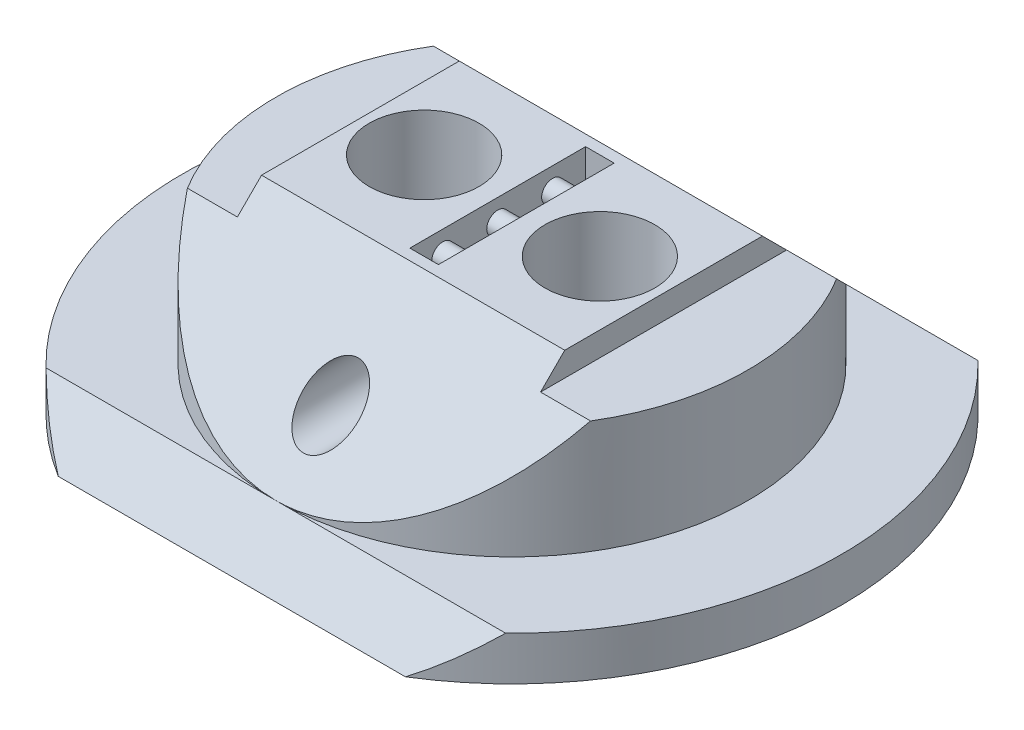
ISO-10303-21;
HEADER;
FILE_DESCRIPTION(('STEP AP214'),'2;1');
FILE_NAME('part.step','',(''),(''),'','','');
FILE_SCHEMA(('AUTOMOTIVE_DESIGN { 1 0 10303 214 1 1 1 1 }'));
ENDSEC;
DATA;
#1=APPLICATION_CONTEXT('core data for automotive mechanical design processes');
#2=APPLICATION_PROTOCOL_DEFINITION('international standard','automotive_design',2000,#1);
#3=PRODUCT_CONTEXT('',#1,'mechanical');
#4=PRODUCT('Part','Part','',(#3));
#5=PRODUCT_RELATED_PRODUCT_CATEGORY('part','',(#4));
#6=PRODUCT_DEFINITION_FORMATION('','',#4);
#7=PRODUCT_DEFINITION_CONTEXT('part definition',#1,'design');
#8=PRODUCT_DEFINITION('design','',#6,#7);
#9=PRODUCT_DEFINITION_SHAPE('','',#8);
#10=(LENGTH_UNIT() NAMED_UNIT(*) SI_UNIT(.MILLI.,.METRE.));
#11=(NAMED_UNIT(*) PLANE_ANGLE_UNIT() SI_UNIT($,.RADIAN.));
#12=(NAMED_UNIT(*) SI_UNIT($,.STERADIAN.) SOLID_ANGLE_UNIT());
#13=UNCERTAINTY_MEASURE_WITH_UNIT(LENGTH_MEASURE(1.E-05),#10,'distance_accuracy_value','');
#14=(GEOMETRIC_REPRESENTATION_CONTEXT(3) GLOBAL_UNCERTAINTY_ASSIGNED_CONTEXT((#13)) GLOBAL_UNIT_ASSIGNED_CONTEXT((#10,
#11,#12)) REPRESENTATION_CONTEXT('',''));
#15=CARTESIAN_POINT('',(0.,0.,0.));
#16=DIRECTION('',(0.,0.,1.));
#17=DIRECTION('',(1.,0.,0.));
#18=AXIS2_PLACEMENT_3D('',#15,#16,#17);
#19=CARTESIAN_POINT('',(0.,0.,0.));
#20=DIRECTION('',(0.,1.,0.));
#21=DIRECTION('',(0.,0.,1.));
#22=AXIS2_PLACEMENT_3D('',#19,#20,#21);
#23=PLANE('',#22);
#24=CARTESIAN_POINT('',(0.,0.,0.));
#25=DIRECTION('',(0.,-1.,0.));
#26=DIRECTION('',(0.,0.,-1.));
#27=AXIS2_PLACEMENT_3D('',#24,#25,#26);
#28=CIRCLE('',#27,1.5);
#29=CARTESIAN_POINT('',(0.,0.,-1.5));
#30=VERTEX_POINT('',#29);
#31=EDGE_CURVE('E196',#30,#30,#28,.T.);
#32=ORIENTED_EDGE('',*,*,#31,.F.);
#33=EDGE_LOOP('',(#32));
#34=FACE_BOUND('',#33,.T.);
#35=CARTESIAN_POINT('',(-8.,0.,0.));
#36=DIRECTION('',(0.,1.,0.));
#37=DIRECTION('',(0.,0.,1.));
#38=AXIS2_PLACEMENT_3D('',#35,#36,#37);
#39=CIRCLE('',#38,5.);
#40=CARTESIAN_POINT('',(-8.,0.,5.));
#41=VERTEX_POINT('',#40);
#42=EDGE_CURVE('E242',#41,#41,#39,.T.);
#43=ORIENTED_EDGE('',*,*,#42,.T.);
#44=EDGE_LOOP('',(#43));
#45=FACE_BOUND('',#44,.T.);
#46=CARTESIAN_POINT('',(8.,0.,0.));
#47=DIRECTION('',(0.,1.,0.));
#48=DIRECTION('',(0.,0.,1.));
#49=AXIS2_PLACEMENT_3D('',#46,#47,#48);
#50=CIRCLE('',#49,5.);
#51=CARTESIAN_POINT('',(8.,0.,5.));
#52=VERTEX_POINT('',#51);
#53=EDGE_CURVE('E237',#52,#52,#50,.T.);
#54=ORIENTED_EDGE('',*,*,#53,.T.);
#55=EDGE_LOOP('',(#54));
#56=FACE_BOUND('',#55,.T.);
#57=DIRECTION('',(1.,0.,0.));
#58=VECTOR('',#57,1.);
#59=CARTESIAN_POINT('',(0.,0.,25.5));
#60=LINE('',#59,#58);
#61=CARTESIAN_POINT('',(-15.8034806292791,0.,25.5));
#62=VERTEX_POINT('',#61);
#63=CARTESIAN_POINT('',(15.8034806292791,0.,25.5));
#64=VERTEX_POINT('',#63);
#65=EDGE_CURVE('E259',#62,#64,#60,.T.);
#66=ORIENTED_EDGE('',*,*,#65,.F.);
#67=CARTESIAN_POINT('',(0.,0.,0.));
#68=DIRECTION('',(0.,1.,0.));
#69=DIRECTION('',(0.,0.,1.));
#70=AXIS2_PLACEMENT_3D('',#67,#68,#69);
#71=CIRCLE('',#70,30.);
#72=CARTESIAN_POINT('',(-15.8034806292789,0.,-25.5000000000001));
#73=VERTEX_POINT('',#72);
#74=EDGE_CURVE('E282',#73,#62,#71,.T.);
#75=ORIENTED_EDGE('',*,*,#74,.F.);
#76=DIRECTION('',(-1.,0.,0.));
#77=VECTOR('',#76,1.);
#78=CARTESIAN_POINT('',(0.,0.,-25.5000000000001));
#79=LINE('',#78,#77);
#80=CARTESIAN_POINT('',(15.8034806292789,0.,-25.5000000000001));
#81=VERTEX_POINT('',#80);
#82=EDGE_CURVE('E262',#81,#73,#79,.T.);
#83=ORIENTED_EDGE('',*,*,#82,.F.);
#84=EDGE_CURVE('E273',#64,#81,#71,.T.);
#85=ORIENTED_EDGE('',*,*,#84,.F.);
#86=EDGE_LOOP('',(#66,#75,#83,#85));
#87=FACE_BOUND('',#86,.T.);
#88=ADVANCED_FACE('F54',(#34,#45,#56,#87),#23,.F.);
#89=CARTESIAN_POINT('',(0.,4.,0.));
#90=DIRECTION('',(0.,-1.,0.));
#91=DIRECTION('',(0.,0.,-1.));
#92=AXIS2_PLACEMENT_3D('',#89,#90,#91);
#93=CYLINDRICAL_SURFACE('',#92,30.);
#94=CARTESIAN_POINT('',(0.,4.,0.));
#95=DIRECTION('',(0.,1.,0.));
#96=DIRECTION('',(0.,0.,1.));
#97=AXIS2_PLACEMENT_3D('',#94,#95,#96);
#98=CIRCLE('',#97,30.);
#99=CARTESIAN_POINT('',(20.9224759529077,4.,21.5));
#100=VERTEX_POINT('',#99);
#101=CARTESIAN_POINT('',(20.9224759529077,4.,-21.5));
#102=VERTEX_POINT('',#101);
#103=EDGE_CURVE('E254',#100,#102,#98,.T.);
#104=ORIENTED_EDGE('',*,*,#103,.F.);
#105=CARTESIAN_POINT('',(0.,25.4999999999998,0.));
#106=DIRECTION('',(0.,-0.707106781186551,-0.707106781186544));
#107=DIRECTION('',(0.,-0.707106781186544,0.707106781186551));
#108=AXIS2_PLACEMENT_3D('',#105,#106,#107);
#109=ELLIPSE('',#108,42.4264068711926,30.);
#110=EDGE_CURVE('E274',#64,#100,#109,.F.);
#111=ORIENTED_EDGE('',*,*,#110,.F.);
#112=ORIENTED_EDGE('',*,*,#84,.T.);
#113=CARTESIAN_POINT('',(0.,25.4999999999995,0.));
#114=DIRECTION('',(0.,-0.707106781186556,0.707106781186539));
#115=DIRECTION('',(0.,-0.707106781186539,-0.707106781186556));
#116=AXIS2_PLACEMENT_3D('',#113,#114,#115);
#117=ELLIPSE('',#116,42.4264068711924,30.);
#118=EDGE_CURVE('E271',#102,#81,#117,.F.);
#119=ORIENTED_EDGE('',*,*,#118,.F.);
#120=EDGE_LOOP('',(#104,#111,#112,#119));
#121=FACE_BOUND('',#120,.T.);
#122=ADVANCED_FACE('F56',(#121),#93,.T.);
#123=CARTESIAN_POINT('',(0.,4.,0.));
#124=DIRECTION('',(0.,1.,0.));
#125=DIRECTION('',(0.,0.,1.));
#126=AXIS2_PLACEMENT_3D('',#123,#124,#125);
#127=CIRCLE('',#126,30.);
#128=CARTESIAN_POINT('',(-20.9224759529077,4.,-21.5));
#129=VERTEX_POINT('',#128);
#130=CARTESIAN_POINT('',(-20.9224759529077,4.,21.5));
#131=VERTEX_POINT('',#130);
#132=EDGE_CURVE('E252',#129,#131,#127,.T.);
#133=ORIENTED_EDGE('',*,*,#132,.F.);
#134=CARTESIAN_POINT('',(0.,25.4999999999995,0.));
#135=DIRECTION('',(0.,0.707106781186556,-0.707106781186539));
#136=DIRECTION('',(0.,-0.707106781186539,-0.707106781186556));
#137=AXIS2_PLACEMENT_3D('',#134,#135,#136);
#138=ELLIPSE('',#137,42.4264068711924,30.);
#139=EDGE_CURVE('E265',#129,#73,#138,.F.);
#140=ORIENTED_EDGE('',*,*,#139,.T.);
#141=ORIENTED_EDGE('',*,*,#74,.T.);
#142=CARTESIAN_POINT('',(0.,25.4999999999998,0.));
#143=DIRECTION('',(0.,0.707106781186551,0.707106781186544));
#144=DIRECTION('',(0.,-0.707106781186544,0.707106781186551));
#145=AXIS2_PLACEMENT_3D('',#142,#143,#144);
#146=ELLIPSE('',#145,42.4264068711926,30.);
#147=EDGE_CURVE('E267',#62,#131,#146,.F.);
#148=ORIENTED_EDGE('',*,*,#147,.T.);
#149=EDGE_LOOP('',(#133,#140,#141,#148));
#150=FACE_BOUND('',#149,.T.);
#151=ADVANCED_FACE('F355',(#150),#93,.T.);
#152=CARTESIAN_POINT('',(30.001,16.5,8.99999999999987));
#153=DIRECTION('',(0.,-0.707106781186551,-0.707106781186544));
#154=DIRECTION('',(0.,0.707106781186544,-0.707106781186551));
#155=AXIS2_PLACEMENT_3D('',#152,#153,#154);
#156=PLANE('',#155);
#157=DIRECTION('',(1.,0.,0.));
#158=VECTOR('',#157,1.);
#159=CARTESIAN_POINT('',(30.001,4.,21.5));
#160=LINE('',#159,#158);
#161=CARTESIAN_POINT('',(0.,3.99999999999999,21.5));
#162=VERTEX_POINT('',#161);
#163=EDGE_CURVE('E258',#131,#162,#160,.T.);
#164=ORIENTED_EDGE('',*,*,#163,.F.);
#165=ORIENTED_EDGE('',*,*,#147,.F.);
#166=ORIENTED_EDGE('',*,*,#65,.T.);
#167=ORIENTED_EDGE('',*,*,#110,.T.);
#168=EDGE_CURVE('E256',#162,#100,#160,.T.);
#169=ORIENTED_EDGE('',*,*,#168,.F.);
#170=EDGE_LOOP('',(#164,#165,#166,#167,#169));
#171=FACE_BOUND('',#170,.T.);
#172=ADVANCED_FACE('F375',(#171),#156,.F.);
#173=CARTESIAN_POINT('',(30.001,16.5,-8.99999999999971));
#174=DIRECTION('',(0.,-0.707106781186556,0.707106781186539));
#175=DIRECTION('',(0.,-0.707106781186539,-0.707106781186556));
#176=AXIS2_PLACEMENT_3D('',#173,#174,#175);
#177=PLANE('',#176);
#178=DIRECTION('',(-1.,0.,0.));
#179=VECTOR('',#178,1.);
#180=CARTESIAN_POINT('',(30.001,4.,-21.5));
#181=LINE('',#180,#179);
#182=CARTESIAN_POINT('',(0.,4.,-21.5));
#183=VERTEX_POINT('',#182);
#184=EDGE_CURVE('E290',#102,#183,#181,.T.);
#185=ORIENTED_EDGE('',*,*,#184,.F.);
#186=ORIENTED_EDGE('',*,*,#118,.T.);
#187=ORIENTED_EDGE('',*,*,#82,.T.);
#188=ORIENTED_EDGE('',*,*,#139,.F.);
#189=EDGE_CURVE('E288',#183,#129,#181,.T.);
#190=ORIENTED_EDGE('',*,*,#189,.F.);
#191=EDGE_LOOP('',(#185,#186,#187,#188,#190));
#192=FACE_BOUND('',#191,.T.);
#193=ADVANCED_FACE('F366',(#192),#177,.F.);
#194=CARTESIAN_POINT('',(0.,96.0338927753446,0.));
#195=DIRECTION('',(0.,-1.,0.));
#196=DIRECTION('',(0.,0.,-1.));
#197=AXIS2_PLACEMENT_3D('',#194,#195,#196);
#198=CYLINDRICAL_SURFACE('',#197,21.5);
#199=CARTESIAN_POINT('',(0.,14.3,0.));
#200=DIRECTION('',(0.,-1.,0.));
#201=DIRECTION('',(1.,0.,0.));
#202=AXIS2_PLACEMENT_3D('',#199,#200,#201);
#203=CIRCLE('',#202,21.5);
#204=CARTESIAN_POINT('',(18.3523840413175,14.3,-11.1999999999998));
#205=VERTEX_POINT('',#204);
#206=CARTESIAN_POINT('',(18.3523840413174,14.3,11.1999999999999));
#207=VERTEX_POINT('',#206);
#208=EDGE_CURVE('E228',#205,#207,#203,.T.);
#209=ORIENTED_EDGE('',*,*,#208,.T.);
#210=CARTESIAN_POINT('',(0.,25.4999999999998,0.));
#211=DIRECTION('',(0.,-0.707106781186551,-0.707106781186544));
#212=DIRECTION('',(0.,-0.707106781186544,0.707106781186551));
#213=AXIS2_PLACEMENT_3D('',#210,#211,#212);
#214=ELLIPSE('',#213,30.4055915910214,21.5);
#215=EDGE_CURVE('E251',#162,#207,#214,.F.);
#216=ORIENTED_EDGE('',*,*,#215,.F.);
#217=CARTESIAN_POINT('',(0.,4.,0.));
#218=DIRECTION('',(0.,1.,0.));
#219=DIRECTION('',(0.,0.,1.));
#220=AXIS2_PLACEMENT_3D('',#217,#218,#219);
#221=CIRCLE('',#220,21.5);
#222=EDGE_CURVE('E246',#162,#183,#221,.T.);
#223=ORIENTED_EDGE('',*,*,#222,.T.);
#224=CARTESIAN_POINT('',(0.,25.4999999999995,0.));
#225=DIRECTION('',(0.,-0.707106781186556,0.707106781186539));
#226=DIRECTION('',(0.,-0.707106781186539,-0.707106781186556));
#227=AXIS2_PLACEMENT_3D('',#224,#225,#226);
#228=ELLIPSE('',#227,30.4055915910212,21.5);
#229=EDGE_CURVE('E285',#205,#183,#228,.F.);
#230=ORIENTED_EDGE('',*,*,#229,.F.);
#231=EDGE_LOOP('',(#209,#216,#223,#230));
#232=FACE_BOUND('',#231,.T.);
#233=ADVANCED_FACE('F376',(#232),#198,.T.);
#234=CARTESIAN_POINT('',(0.,4.,0.));
#235=DIRECTION('',(0.,1.,0.));
#236=DIRECTION('',(0.,0.,1.));
#237=AXIS2_PLACEMENT_3D('',#234,#235,#236);
#238=PLANE('',#237);
#239=ORIENTED_EDGE('',*,*,#168,.T.);
#240=ORIENTED_EDGE('',*,*,#103,.T.);
#241=ORIENTED_EDGE('',*,*,#184,.T.);
#242=ORIENTED_EDGE('',*,*,#222,.F.);
#243=EDGE_LOOP('',(#239,#240,#241,#242));
#244=FACE_BOUND('',#243,.T.);
#245=ADVANCED_FACE('F379',(#244),#238,.T.);
#246=ORIENTED_EDGE('',*,*,#163,.T.);
#247=EDGE_CURVE('E245',#183,#162,#221,.T.);
#248=ORIENTED_EDGE('',*,*,#247,.F.);
#249=ORIENTED_EDGE('',*,*,#189,.T.);
#250=ORIENTED_EDGE('',*,*,#132,.T.);
#251=EDGE_LOOP('',(#246,#248,#249,#250));
#252=FACE_BOUND('',#251,.T.);
#253=ADVANCED_FACE('F381',(#252),#238,.T.);
#254=CARTESIAN_POINT('',(-18.3523840413174,14.3,11.1999999999999));
#255=VERTEX_POINT('',#254);
#256=EDGE_CURVE('E249',#255,#162,#214,.F.);
#257=ORIENTED_EDGE('',*,*,#256,.F.);
#258=CARTESIAN_POINT('',(0.,14.3,0.));
#259=DIRECTION('',(0.,-1.,0.));
#260=DIRECTION('',(0.,0.,-1.));
#261=AXIS2_PLACEMENT_3D('',#258,#259,#260);
#262=CIRCLE('',#261,21.5);
#263=CARTESIAN_POINT('',(-18.3523840413175,14.3,-11.1999999999998));
#264=VERTEX_POINT('',#263);
#265=EDGE_CURVE('E77',#255,#264,#262,.T.);
#266=ORIENTED_EDGE('',*,*,#265,.T.);
#267=EDGE_CURVE('E287',#183,#264,#228,.F.);
#268=ORIENTED_EDGE('',*,*,#267,.F.);
#269=ORIENTED_EDGE('',*,*,#247,.T.);
#270=EDGE_LOOP('',(#257,#266,#268,#269));
#271=FACE_BOUND('',#270,.T.);
#272=ADVANCED_FACE('F364',(#271),#198,.T.);
#273=CARTESIAN_POINT('',(0.,9.,-16.4999999999999));
#274=DIRECTION('',(0.,-0.707106781186556,0.707106781186539));
#275=DIRECTION('',(0.,0.707106781186539,0.707106781186556));
#276=AXIS2_PLACEMENT_3D('',#273,#274,#275);
#277=ELLIPSE('',#276,3.53553390593278,2.5);
#278=CARTESIAN_POINT('',(0.,11.5,-13.9999999999998));
#279=VERTEX_POINT('',#278);
#280=EDGE_CURVE('E203',#279,#279,#277,.T.);
#281=ORIENTED_EDGE('',*,*,#280,.T.);
#282=EDGE_LOOP('',(#281));
#283=FACE_BOUND('',#282,.T.);
#284=DIRECTION('',(1.,0.,0.));
#285=VECTOR('',#284,1.);
#286=CARTESIAN_POINT('',(30.001,14.3,-11.1999999999998));
#287=LINE('',#286,#285);
#288=CARTESIAN_POINT('',(-13.8,14.3,-11.1999999999998));
#289=VERTEX_POINT('',#288);
#290=EDGE_CURVE('E214',#264,#289,#287,.T.);
#291=ORIENTED_EDGE('',*,*,#290,.T.);
#292=DIRECTION('',(0.,0.707106781186539,0.707106781186556));
#293=VECTOR('',#292,1.);
#294=CARTESIAN_POINT('',(-13.8,16.5,-8.99999999999971));
#295=LINE('',#294,#293);
#296=CARTESIAN_POINT('',(-13.8,16.5,-8.99999999999971));
#297=VERTEX_POINT('',#296);
#298=EDGE_CURVE('E217',#289,#297,#295,.T.);
#299=ORIENTED_EDGE('',*,*,#298,.T.);
#300=DIRECTION('',(-1.,0.,0.));
#301=VECTOR('',#300,1.);
#302=CARTESIAN_POINT('',(30.001,16.5,-8.99999999999971));
#303=LINE('',#302,#301);
#304=CARTESIAN_POINT('',(13.8,16.5,-8.99999999999971));
#305=VERTEX_POINT('',#304);
#306=EDGE_CURVE('E277',#305,#297,#303,.T.);
#307=ORIENTED_EDGE('',*,*,#306,.F.);
#308=DIRECTION('',(0.,-0.707106781186539,-0.707106781186556));
#309=VECTOR('',#308,1.);
#310=CARTESIAN_POINT('',(13.8,16.5,-8.99999999999971));
#311=LINE('',#310,#309);
#312=CARTESIAN_POINT('',(13.8,14.3,-11.1999999999998));
#313=VERTEX_POINT('',#312);
#314=EDGE_CURVE('E224',#305,#313,#311,.T.);
#315=ORIENTED_EDGE('',*,*,#314,.T.);
#316=DIRECTION('',(1.,0.,0.));
#317=VECTOR('',#316,1.);
#318=CARTESIAN_POINT('',(30.001,14.3,-11.1999999999998));
#319=LINE('',#318,#317);
#320=EDGE_CURVE('E230',#313,#205,#319,.T.);
#321=ORIENTED_EDGE('',*,*,#320,.T.);
#322=ORIENTED_EDGE('',*,*,#229,.T.);
#323=ORIENTED_EDGE('',*,*,#267,.T.);
#324=EDGE_LOOP('',(#291,#299,#307,#315,#321,#322,#323));
#325=FACE_BOUND('',#324,.T.);
#326=ADVANCED_FACE('F360',(#283,#325),#177,.F.);
#327=CARTESIAN_POINT('',(30.001,16.5,8.99999999999987));
#328=DIRECTION('',(0.,-1.,0.));
#329=DIRECTION('',(0.,0.,-1.));
#330=AXIS2_PLACEMENT_3D('',#327,#328,#329);
#331=PLANE('',#330);
#332=DIRECTION('',(1.,0.,0.));
#333=VECTOR('',#332,1.);
#334=CARTESIAN_POINT('',(-1.3,16.5,7.99999999999987));
#335=LINE('',#334,#333);
#336=CARTESIAN_POINT('',(-1.3,16.5,7.99999999999987));
#337=VERTEX_POINT('',#336);
#338=CARTESIAN_POINT('',(1.3,16.5,7.99999999999987));
#339=VERTEX_POINT('',#338);
#340=EDGE_CURVE('E190',#337,#339,#335,.T.);
#341=ORIENTED_EDGE('',*,*,#340,.F.);
#342=DIRECTION('',(0.,0.,1.));
#343=VECTOR('',#342,1.);
#344=CARTESIAN_POINT('',(-1.3,16.5,-7.99999999999971));
#345=LINE('',#344,#343);
#346=CARTESIAN_POINT('',(-1.3,16.5,-7.99999999999971));
#347=VERTEX_POINT('',#346);
#348=EDGE_CURVE('E69',#347,#337,#345,.T.);
#349=ORIENTED_EDGE('',*,*,#348,.F.);
#350=DIRECTION('',(-1.,0.,0.));
#351=VECTOR('',#350,1.);
#352=CARTESIAN_POINT('',(-1.3,16.5,-7.99999999999971));
#353=LINE('',#352,#351);
#354=CARTESIAN_POINT('',(1.3,16.5,-7.99999999999971));
#355=VERTEX_POINT('',#354);
#356=EDGE_CURVE('E181',#355,#347,#353,.T.);
#357=ORIENTED_EDGE('',*,*,#356,.F.);
#358=DIRECTION('',(0.,0.,-1.));
#359=VECTOR('',#358,1.);
#360=CARTESIAN_POINT('',(1.3,16.5,-7.99999999999971));
#361=LINE('',#360,#359);
#362=EDGE_CURVE('E184',#339,#355,#361,.T.);
#363=ORIENTED_EDGE('',*,*,#362,.F.);
#364=EDGE_LOOP('',(#341,#349,#357,#363));
#365=FACE_BOUND('',#364,.T.);
#366=CARTESIAN_POINT('',(-8.,16.5,0.));
#367=DIRECTION('',(0.,1.,0.));
#368=DIRECTION('',(0.,0.,1.));
#369=AXIS2_PLACEMENT_3D('',#366,#367,#368);
#370=CIRCLE('',#369,5.);
#371=CARTESIAN_POINT('',(-8.,16.5,5.00000000000001));
#372=VERTEX_POINT('',#371);
#373=EDGE_CURVE('E234',#372,#372,#370,.T.);
#374=ORIENTED_EDGE('',*,*,#373,.F.);
#375=EDGE_LOOP('',(#374));
#376=FACE_BOUND('',#375,.T.);
#377=CARTESIAN_POINT('',(8.,16.5,0.));
#378=DIRECTION('',(0.,1.,0.));
#379=DIRECTION('',(0.,0.,1.));
#380=AXIS2_PLACEMENT_3D('',#377,#378,#379);
#381=CIRCLE('',#380,5.);
#382=CARTESIAN_POINT('',(8.,16.5,5.));
#383=VERTEX_POINT('',#382);
#384=EDGE_CURVE('E233',#383,#383,#381,.T.);
#385=ORIENTED_EDGE('',*,*,#384,.F.);
#386=EDGE_LOOP('',(#385));
#387=FACE_BOUND('',#386,.T.);
#388=ORIENTED_EDGE('',*,*,#306,.T.);
#389=DIRECTION('',(0.,0.,1.));
#390=VECTOR('',#389,1.);
#391=CARTESIAN_POINT('',(-13.8,16.5,-25.5000000000001));
#392=LINE('',#391,#390);
#393=CARTESIAN_POINT('',(-13.8,16.5,8.99999999999986));
#394=VERTEX_POINT('',#393);
#395=EDGE_CURVE('E208',#297,#394,#392,.T.);
#396=ORIENTED_EDGE('',*,*,#395,.T.);
#397=DIRECTION('',(-1.,0.,0.));
#398=VECTOR('',#397,1.);
#399=CARTESIAN_POINT('',(30.001,16.5,8.99999999999987));
#400=LINE('',#399,#398);
#401=CARTESIAN_POINT('',(13.8,16.5,8.99999999999987));
#402=VERTEX_POINT('',#401);
#403=EDGE_CURVE('E270',#402,#394,#400,.T.);
#404=ORIENTED_EDGE('',*,*,#403,.F.);
#405=DIRECTION('',(0.,0.,1.));
#406=VECTOR('',#405,1.);
#407=CARTESIAN_POINT('',(13.8,16.5,-25.5000000000001));
#408=LINE('',#407,#406);
#409=EDGE_CURVE('E220',#305,#402,#408,.T.);
#410=ORIENTED_EDGE('',*,*,#409,.F.);
#411=EDGE_LOOP('',(#388,#396,#404,#410));
#412=FACE_BOUND('',#411,.T.);
#413=ADVANCED_FACE('F363',(#365,#376,#387,#412),#331,.F.);
#414=CARTESIAN_POINT('',(0.,9.,16.5));
#415=DIRECTION('',(0.,-0.707106781186551,-0.707106781186544));
#416=DIRECTION('',(0.,-0.707106781186544,0.707106781186551));
#417=AXIS2_PLACEMENT_3D('',#414,#415,#416);
#418=ELLIPSE('',#417,3.53553390593276,2.5);
#419=CARTESIAN_POINT('',(0.,6.5,19.));
#420=VERTEX_POINT('',#419);
#421=EDGE_CURVE('E207',#420,#420,#418,.T.);
#422=ORIENTED_EDGE('',*,*,#421,.T.);
#423=EDGE_LOOP('',(#422));
#424=FACE_BOUND('',#423,.T.);
#425=ORIENTED_EDGE('',*,*,#403,.T.);
#426=DIRECTION('',(0.,-0.707106781186544,0.707106781186551));
#427=VECTOR('',#426,1.);
#428=CARTESIAN_POINT('',(-13.8,16.5,8.99999999999987));
#429=LINE('',#428,#427);
#430=CARTESIAN_POINT('',(-13.8,14.3,11.1999999999999));
#431=VERTEX_POINT('',#430);
#432=EDGE_CURVE('E299',#394,#431,#429,.T.);
#433=ORIENTED_EDGE('',*,*,#432,.T.);
#434=DIRECTION('',(-1.,0.,0.));
#435=VECTOR('',#434,1.);
#436=CARTESIAN_POINT('',(30.001,14.3,11.1999999999999));
#437=LINE('',#436,#435);
#438=EDGE_CURVE('E297',#431,#255,#437,.T.);
#439=ORIENTED_EDGE('',*,*,#438,.T.);
#440=ORIENTED_EDGE('',*,*,#256,.T.);
#441=ORIENTED_EDGE('',*,*,#215,.T.);
#442=DIRECTION('',(-1.,0.,0.));
#443=VECTOR('',#442,1.);
#444=CARTESIAN_POINT('',(30.001,14.3,11.1999999999999));
#445=LINE('',#444,#443);
#446=CARTESIAN_POINT('',(13.8,14.3,11.1999999999999));
#447=VERTEX_POINT('',#446);
#448=EDGE_CURVE('E294',#207,#447,#445,.T.);
#449=ORIENTED_EDGE('',*,*,#448,.T.);
#450=DIRECTION('',(0.,0.707106781186544,-0.707106781186551));
#451=VECTOR('',#450,1.);
#452=CARTESIAN_POINT('',(13.8,16.5,8.99999999999987));
#453=LINE('',#452,#451);
#454=EDGE_CURVE('E291',#447,#402,#453,.T.);
#455=ORIENTED_EDGE('',*,*,#454,.T.);
#456=EDGE_LOOP('',(#425,#433,#439,#440,#441,#449,#455));
#457=FACE_BOUND('',#456,.T.);
#458=ADVANCED_FACE('F369',(#424,#457),#156,.F.);
#459=CARTESIAN_POINT('',(8.,-7.50000000000001,0.));
#460=DIRECTION('',(0.,1.,0.));
#461=DIRECTION('',(0.,0.,1.));
#462=AXIS2_PLACEMENT_3D('',#459,#460,#461);
#463=CYLINDRICAL_SURFACE('',#462,5.);
#464=ORIENTED_EDGE('',*,*,#384,.T.);
#465=EDGE_LOOP('',(#464));
#466=FACE_BOUND('',#465,.T.);
#467=ORIENTED_EDGE('',*,*,#53,.F.);
#468=EDGE_LOOP('',(#467));
#469=FACE_BOUND('',#468,.T.);
#470=ADVANCED_FACE('F373',(#466,#469),#463,.F.);
#471=CARTESIAN_POINT('',(-8.,-7.50000000000001,0.));
#472=DIRECTION('',(0.,1.,0.));
#473=DIRECTION('',(0.,0.,1.));
#474=AXIS2_PLACEMENT_3D('',#471,#472,#473);
#475=CYLINDRICAL_SURFACE('',#474,5.);
#476=ORIENTED_EDGE('',*,*,#373,.T.);
#477=EDGE_LOOP('',(#476));
#478=FACE_BOUND('',#477,.T.);
#479=ORIENTED_EDGE('',*,*,#42,.F.);
#480=EDGE_LOOP('',(#479));
#481=FACE_BOUND('',#480,.T.);
#482=ADVANCED_FACE('F387',(#478,#481),#475,.F.);
#483=CARTESIAN_POINT('',(21.5,14.3,-25.5000000000001));
#484=DIRECTION('',(0.,-1.,0.));
#485=DIRECTION('',(1.,0.,0.));
#486=AXIS2_PLACEMENT_3D('',#483,#484,#485);
#487=PLANE('',#486);
#488=DIRECTION('',(0.,0.,1.));
#489=VECTOR('',#488,1.);
#490=CARTESIAN_POINT('',(13.8,14.3,-25.5000000000001));
#491=LINE('',#490,#489);
#492=EDGE_CURVE('E221',#313,#447,#491,.T.);
#493=ORIENTED_EDGE('',*,*,#492,.T.);
#494=ORIENTED_EDGE('',*,*,#448,.F.);
#495=ORIENTED_EDGE('',*,*,#208,.F.);
#496=ORIENTED_EDGE('',*,*,#320,.F.);
#497=EDGE_LOOP('',(#493,#494,#495,#496));
#498=FACE_BOUND('',#497,.T.);
#499=ADVANCED_FACE('F391',(#498),#487,.F.);
#500=CARTESIAN_POINT('',(13.8,14.3,-25.5000000000001));
#501=DIRECTION('',(-1.,0.,0.));
#502=DIRECTION('',(0.,0.,1.));
#503=AXIS2_PLACEMENT_3D('',#500,#501,#502);
#504=PLANE('',#503);
#505=ORIENTED_EDGE('',*,*,#409,.T.);
#506=ORIENTED_EDGE('',*,*,#454,.F.);
#507=ORIENTED_EDGE('',*,*,#492,.F.);
#508=ORIENTED_EDGE('',*,*,#314,.F.);
#509=EDGE_LOOP('',(#505,#506,#507,#508));
#510=FACE_BOUND('',#509,.T.);
#511=ADVANCED_FACE('F393',(#510),#504,.F.);
#512=CARTESIAN_POINT('',(-13.8,14.3,-25.5000000000001));
#513=DIRECTION('',(1.,0.,0.));
#514=DIRECTION('',(0.,0.,-1.));
#515=AXIS2_PLACEMENT_3D('',#512,#513,#514);
#516=PLANE('',#515);
#517=DIRECTION('',(0.,0.,1.));
#518=VECTOR('',#517,1.);
#519=CARTESIAN_POINT('',(-13.8,14.3,-25.5000000000001));
#520=LINE('',#519,#518);
#521=EDGE_CURVE('E206',#289,#431,#520,.T.);
#522=ORIENTED_EDGE('',*,*,#521,.T.);
#523=ORIENTED_EDGE('',*,*,#432,.F.);
#524=ORIENTED_EDGE('',*,*,#395,.F.);
#525=ORIENTED_EDGE('',*,*,#298,.F.);
#526=EDGE_LOOP('',(#522,#523,#524,#525));
#527=FACE_BOUND('',#526,.T.);
#528=ADVANCED_FACE('F396',(#527),#516,.F.);
#529=CARTESIAN_POINT('',(-21.5,14.3,-25.5000000000001));
#530=DIRECTION('',(0.,-1.,0.));
#531=DIRECTION('',(0.,0.,-1.));
#532=AXIS2_PLACEMENT_3D('',#529,#530,#531);
#533=PLANE('',#532);
#534=ORIENTED_EDGE('',*,*,#265,.F.);
#535=ORIENTED_EDGE('',*,*,#438,.F.);
#536=ORIENTED_EDGE('',*,*,#521,.F.);
#537=ORIENTED_EDGE('',*,*,#290,.F.);
#538=EDGE_LOOP('',(#534,#535,#536,#537));
#539=FACE_BOUND('',#538,.T.);
#540=ADVANCED_FACE('F401',(#539),#533,.F.);
#541=CARTESIAN_POINT('',(0.,9.,-25.5000000000001));
#542=DIRECTION('',(0.,0.,1.));
#543=DIRECTION('',(1.,0.,0.));
#544=AXIS2_PLACEMENT_3D('',#541,#542,#543);
#545=CYLINDRICAL_SURFACE('',#544,2.5);
#546=CARTESIAN_POINT('',(0.,6.5,-1.5));
#547=CARTESIAN_POINT('',(0.0767298334620158,6.50000374210268,-1.49999590899012));
#548=CARTESIAN_POINT('',(0.153582320644178,6.5035709538499,-1.49407132907374));
#549=CARTESIAN_POINT('',(0.304975509530679,6.51750096391432,-1.47067568048467));
#550=CARTESIAN_POINT('',(0.379510034596047,6.52788051967281,-1.45317613814578));
#551=CARTESIAN_POINT('',(0.523751827790836,6.55438441945512,-1.40761363883314));
#552=CARTESIAN_POINT('',(0.593481028226565,6.57048026727056,-1.37960304183684));
#553=CARTESIAN_POINT('',(0.727030318214658,6.60704632373592,-1.31413966685897));
#554=CARTESIAN_POINT('',(0.790851869416382,6.62751544619745,-1.27668923303125));
#555=CARTESIAN_POINT('',(0.916299278999315,6.67294639280912,-1.19022517329142));
#556=CARTESIAN_POINT('',(0.977384020081415,6.69813207804015,-1.14054630464861));
#557=CARTESIAN_POINT('',(1.09088270411891,6.74969560720366,-1.03253279617173));
#558=CARTESIAN_POINT('',(1.14328534948112,6.77607494846429,-0.974187062812683));
#559=CARTESIAN_POINT('',(1.24444996762974,6.8308893300409,-0.842076489503268));
#560=CARTESIAN_POINT('',(1.29197766378809,6.85917982296351,-0.767298229018711));
#561=CARTESIAN_POINT('',(1.37361437764896,6.91061698587876,-0.609153426756886));
#562=CARTESIAN_POINT('',(1.4077451733516,6.93377197726062,-0.525801103752432));
#563=CARTESIAN_POINT('',(1.45440601714221,6.9664537033907,-0.373403549346759));
#564=CARTESIAN_POINT('',(1.47016197246826,6.97792116862409,-0.305764001389683));
#565=CARTESIAN_POINT('',(1.49216172340475,6.99409691704497,-0.168196284169636));
#566=CARTESIAN_POINT('',(1.49841734556836,6.9988136035624,-0.098271071245506));
#567=CARTESIAN_POINT('',(1.50105508796009,7.00079077536144,0.0420114942173356));
#568=CARTESIAN_POINT('',(1.49741783408419,6.99803662987282,0.112369425093197));
#569=CARTESIAN_POINT('',(1.48046060478828,6.98546738556258,0.251278775427587));
#570=CARTESIAN_POINT('',(1.46713334620103,6.97564697567774,0.319828795847444));
#571=CARTESIAN_POINT('',(1.43173921881792,6.95046813055742,0.452530242128105));
#572=CARTESIAN_POINT('',(1.40978748666087,6.93518288347463,0.516727053924483));
#573=CARTESIAN_POINT('',(1.35795061770837,6.90072948649172,0.640694990928123));
#574=CARTESIAN_POINT('',(1.32806257259705,6.88155991376535,0.700464483423926));
#575=CARTESIAN_POINT('',(1.25517983184583,6.83744672731015,0.824984097122803));
#576=CARTESIAN_POINT('',(1.21080724397723,6.81207956627008,0.888778092954926));
#577=CARTESIAN_POINT('',(1.11291092784003,6.76069400235619,1.00867648366702));
#578=CARTESIAN_POINT('',(1.05937845100579,6.73467499737851,1.06477343397651));
#579=CARTESIAN_POINT('',(0.935811834382966,6.68064495041683,1.17561298182176));
#580=CARTESIAN_POINT('',(0.864517682704956,6.65286163731467,1.22907730601599));
#581=CARTESIAN_POINT('',(0.712276050458999,6.60227571566019,1.32312204719791));
#582=CARTESIAN_POINT('',(0.631333763943563,6.57947044574485,1.36370935378995));
#583=CARTESIAN_POINT('',(0.467197585268205,6.54269607933849,1.4279321827959));
#584=CARTESIAN_POINT('',(0.384467624173579,6.52826042560296,1.45247535571591));
#585=CARTESIAN_POINT('',(0.215047895144638,6.50781157186449,1.48701119740538));
#586=CARTESIAN_POINT('',(0.128363005661318,6.50178827047262,1.49702131775358));
#587=CARTESIAN_POINT('',(-0.0337146143773965,6.4990942962539,1.50150784767831));
#588=CARTESIAN_POINT('',(-0.109042473418718,6.50126478285714,1.49790885508517));
#589=CARTESIAN_POINT('',(-0.25782940198606,6.51221287912951,1.47957414692808));
#590=CARTESIAN_POINT('',(-0.331288509376106,6.52099035481962,1.46483865719419));
#591=CARTESIAN_POINT('',(-0.472574932157613,6.54405207557809,1.42545656718754));
#592=CARTESIAN_POINT('',(-0.540495750928484,6.55819724337445,1.40105965092653));
#593=CARTESIAN_POINT('',(-0.671265749087263,6.59086119137155,1.34332262363473));
#594=CARTESIAN_POINT('',(-0.734113924963909,6.60938083413489,1.30998074865333));
#595=CARTESIAN_POINT('',(-0.860006262823864,6.65154503762639,1.23144302079129));
#596=CARTESIAN_POINT('',(-0.922394150456837,6.6755219726012,1.18537617092161));
#597=CARTESIAN_POINT('',(-1.03902603131014,6.72525734425268,1.08460860651138));
#598=CARTESIAN_POINT('',(-1.09326040273738,6.75101783413639,1.02989784514746));
#599=CARTESIAN_POINT('',(-1.19931996735579,6.80554576090109,0.905089609962848));
#600=CARTESIAN_POINT('',(-1.24991019630915,6.83426758253709,0.833916114534496));
#601=CARTESIAN_POINT('',(-1.33845238915668,6.8878381793329,0.682783975431795));
#602=CARTESIAN_POINT('',(-1.37641766769781,6.9126910200231,0.602834706107214));
#603=CARTESIAN_POINT('',(-1.43142578795776,6.95015090759481,0.45375697769331));
#604=CARTESIAN_POINT('',(-1.4512162533619,6.96424340671271,0.386019687641411));
#605=CARTESIAN_POINT('',(-1.48113663905972,6.98590394256456,0.247467921919896));
#606=CARTESIAN_POINT('',(-1.49127995297631,6.99348102357279,0.176657855672172));
#607=CARTESIAN_POINT('',(-1.50134130416631,7.00099553383732,0.0336230524029674));
#608=CARTESIAN_POINT('',(-1.50122089107869,7.00090423554063,-0.0386059906870438));
#609=CARTESIAN_POINT('',(-1.49066472959328,6.9930228210715,-0.18189443560946));
#610=CARTESIAN_POINT('',(-1.48022337215759,6.9852285186118,-0.252953180080596));
#611=CARTESIAN_POINT('',(-1.45040174148913,6.9636681475702,-0.388488417572187));
#612=CARTESIAN_POINT('',(-1.43147636845351,6.95020788194419,-0.453117094306871));
#613=CARTESIAN_POINT('',(-1.38563242076993,6.91894498039848,-0.578337254474216));
#614=CARTESIAN_POINT('',(-1.35871083588479,6.90114070959518,-0.638927206960553));
#615=CARTESIAN_POINT('',(-1.29289245555732,6.85987009449083,-0.76431985722078));
#616=CARTESIAN_POINT('',(-1.25279167675753,6.8359541241736,-0.828341103854308));
#617=CARTESIAN_POINT('',(-1.16375698389084,6.78679872969232,-0.94938007261729));
#618=CARTESIAN_POINT('',(-1.11481579607798,6.76155822794979,-1.00639196215256));
#619=CARTESIAN_POINT('',(-1.00009777425734,6.70774309708524,-1.12135094913167));
#620=CARTESIAN_POINT('',(-0.932876819313905,6.67929691336342,-1.17793107489619));
#621=CARTESIAN_POINT('',(-0.788462434445589,6.62634571127633,-1.27909785586331));
#622=CARTESIAN_POINT('',(-0.71126544450154,6.60184210689064,-1.32368021198479));
#623=CARTESIAN_POINT('',(-0.551125230801454,6.56014421345606,-1.39778580757374));
#624=CARTESIAN_POINT('',(-0.468430086957215,6.54274922520213,-1.42772806492683));
#625=CARTESIAN_POINT('',(-0.297973306118808,6.51633726998754,-1.47272469521098));
#626=CARTESIAN_POINT('',(-0.210232099648613,6.50728874128515,-1.48783516785699));
#627=CARTESIAN_POINT('',(-0.101558096917536,6.50197998831813,-1.49669745470866));
#628=CARTESIAN_POINT('',(-0.0812762590282775,6.50123885343638,-1.4979344173061));
#629=CARTESIAN_POINT('',(-0.0406658206871124,6.50024835482633,-1.49958624637086));
#630=CARTESIAN_POINT('',(-0.0203372186375695,6.49999900815684,-1.5000010843209));
#631=CARTESIAN_POINT('',(0.,6.5,-1.5));
#632=B_SPLINE_CURVE_WITH_KNOTS('',3,(#546,#547,#548,#549,#550,#551,#552,#553,#554,#555,#556,
#557,#558,#559,#560,#561,#562,#563,#564,#565,#566,#567,#568,#569,#570,#571,#572,#573,#574,#575,
#576,#577,#578,#579,#580,#581,#582,#583,#584,#585,#586,#587,#588,#589,#590,#591,#592,#593,#594,
#595,#596,#597,#598,#599,#600,#601,#602,#603,#604,#605,#606,#607,#608,#609,#610,#611,#612,#613,
#614,#615,#616,#617,#618,#619,#620,#621,#622,#623,#624,#625,#626,#627,#628,#629,#630,#631),
.UNSPECIFIED.,.T.,.F.,(4,2,2,2,2,2,2,2,2,2,2,2,2,2,2,2,2,2,2,2,2,2,2,2,2,2,2,2,2,2,2,2,2,2,2,2,
2,2,2,2,2,2,4),(0.,0.230102237548649,0.460772627520012,0.690308884600011,0.919788197992274,
1.16681590732473,1.414162579348,1.69183813189807,1.96906040692092,2.17933829855633,
2.38935420916578,2.59978170870726,2.81036753273872,3.01823267593207,3.22617409809868,
3.47046995225163,3.71500044803674,3.99360957884691,4.27206939275324,4.5329679069656,
4.79355286918236,5.01875602722426,5.24395461863455,5.46367785689772,5.68344445659025,
5.92601365818362,6.16886690081836,6.44336762428009,6.71757792616456,6.93257787314692,
7.14727888733318,7.36278425777433,7.57840681155725,7.78364098331142,7.98895251523035,
8.22578610052286,8.46281544370208,8.73854311775519,9.01436946031985,9.28175654462676,
9.54812832184448,9.60911473335177,9.6701032602764),.UNSPECIFIED.);
#633=CARTESIAN_POINT('',(0.,6.5,-1.5));
#634=VERTEX_POINT('',#633);
#635=EDGE_CURVE('E202',#634,#634,#632,.T.);
#636=ORIENTED_EDGE('',*,*,#635,.T.);
#637=EDGE_LOOP('',(#636));
#638=FACE_BOUND('',#637,.T.);
#639=ORIENTED_EDGE('',*,*,#421,.F.);
#640=EDGE_LOOP('',(#639));
#641=FACE_BOUND('',#640,.T.);
#642=ORIENTED_EDGE('',*,*,#280,.F.);
#643=EDGE_LOOP('',(#642));
#644=FACE_BOUND('',#643,.T.);
#645=ADVANCED_FACE('F313',(#638,#641,#644),#545,.F.);
#646=CARTESIAN_POINT('',(0.,10.,0.));
#647=DIRECTION('',(0.,-1.,0.));
#648=DIRECTION('',(0.,0.,-1.));
#649=AXIS2_PLACEMENT_3D('',#646,#647,#648);
#650=CYLINDRICAL_SURFACE('',#649,1.5);
#651=ORIENTED_EDGE('',*,*,#31,.T.);
#652=EDGE_LOOP('',(#651));
#653=FACE_BOUND('',#652,.T.);
#654=ORIENTED_EDGE('',*,*,#635,.F.);
#655=EDGE_LOOP('',(#654));
#656=FACE_BOUND('',#655,.T.);
#657=ADVANCED_FACE('F316',(#653,#656),#650,.F.);
#658=CARTESIAN_POINT('',(-1.3,12.5,-7.99999999999971));
#659=DIRECTION('',(-1.,0.,0.));
#660=DIRECTION('',(0.,0.,1.));
#661=AXIS2_PLACEMENT_3D('',#658,#659,#660);
#662=PLANE('',#661);
#663=CARTESIAN_POINT('',(-1.3,14.5,-5.));
#664=DIRECTION('',(-1.,0.,0.));
#665=DIRECTION('',(0.,0.,1.));
#666=AXIS2_PLACEMENT_3D('',#663,#664,#665);
#667=CIRCLE('',#666,1.);
#668=CARTESIAN_POINT('',(-1.3,14.5,-4.));
#669=VERTEX_POINT('',#668);
#670=EDGE_CURVE('E13',#669,#669,#667,.F.);
#671=ORIENTED_EDGE('',*,*,#670,.F.);
#672=EDGE_LOOP('',(#671));
#673=FACE_BOUND('',#672,.T.);
#674=CARTESIAN_POINT('',(-1.3,14.5,0.));
#675=DIRECTION('',(-1.,0.,0.));
#676=DIRECTION('',(0.,0.,1.));
#677=AXIS2_PLACEMENT_3D('',#674,#675,#676);
#678=CIRCLE('',#677,1.);
#679=CARTESIAN_POINT('',(-1.3,14.5,1.));
#680=VERTEX_POINT('',#679);
#681=EDGE_CURVE('E663',#680,#680,#678,.F.);
#682=ORIENTED_EDGE('',*,*,#681,.F.);
#683=EDGE_LOOP('',(#682));
#684=FACE_BOUND('',#683,.T.);
#685=CARTESIAN_POINT('',(-1.3,14.5,5.));
#686=DIRECTION('',(-1.,0.,0.));
#687=DIRECTION('',(0.,0.,1.));
#688=AXIS2_PLACEMENT_3D('',#685,#686,#687);
#689=CIRCLE('',#688,1.);
#690=CARTESIAN_POINT('',(-1.3,14.5,6.));
#691=VERTEX_POINT('',#690);
#692=EDGE_CURVE('E669',#691,#691,#689,.F.);
#693=ORIENTED_EDGE('',*,*,#692,.F.);
#694=EDGE_LOOP('',(#693));
#695=FACE_BOUND('',#694,.T.);
#696=ORIENTED_EDGE('',*,*,#348,.T.);
#697=DIRECTION('',(0.,1.,0.));
#698=VECTOR('',#697,1.);
#699=CARTESIAN_POINT('',(-1.3,12.5,7.99999999999987));
#700=LINE('',#699,#698);
#701=CARTESIAN_POINT('',(-1.3,12.5,7.99999999999987));
#702=VERTEX_POINT('',#701);
#703=EDGE_CURVE('E159',#702,#337,#700,.T.);
#704=ORIENTED_EDGE('',*,*,#703,.F.);
#705=DIRECTION('',(0.,0.,1.));
#706=VECTOR('',#705,1.);
#707=CARTESIAN_POINT('',(-1.3,12.5,-7.99999999999971));
#708=LINE('',#707,#706);
#709=CARTESIAN_POINT('',(-1.3,12.5,-7.99999999999971));
#710=VERTEX_POINT('',#709);
#711=EDGE_CURVE('E163',#710,#702,#708,.T.);
#712=ORIENTED_EDGE('',*,*,#711,.F.);
#713=DIRECTION('',(0.,1.,0.));
#714=VECTOR('',#713,1.);
#715=CARTESIAN_POINT('',(-1.3,12.5,-7.99999999999971));
#716=LINE('',#715,#714);
#717=EDGE_CURVE('E194',#710,#347,#716,.T.);
#718=ORIENTED_EDGE('',*,*,#717,.T.);
#719=EDGE_LOOP('',(#696,#704,#712,#718));
#720=FACE_BOUND('',#719,.T.);
#721=ADVANCED_FACE('F161',(#673,#684,#695,#720),#662,.F.);
#722=CARTESIAN_POINT('',(-1.3,12.5,-7.99999999999971));
#723=DIRECTION('',(0.,0.,-1.));
#724=DIRECTION('',(0.,1.,0.));
#725=AXIS2_PLACEMENT_3D('',#722,#723,#724);
#726=PLANE('',#725);
#727=ORIENTED_EDGE('',*,*,#356,.T.);
#728=ORIENTED_EDGE('',*,*,#717,.F.);
#729=DIRECTION('',(-1.,0.,0.));
#730=VECTOR('',#729,1.);
#731=CARTESIAN_POINT('',(-1.3,12.5,-7.99999999999971));
#732=LINE('',#731,#730);
#733=CARTESIAN_POINT('',(1.3,12.5,-7.99999999999971));
#734=VERTEX_POINT('',#733);
#735=EDGE_CURVE('E169',#734,#710,#732,.T.);
#736=ORIENTED_EDGE('',*,*,#735,.F.);
#737=DIRECTION('',(0.,1.,0.));
#738=VECTOR('',#737,1.);
#739=CARTESIAN_POINT('',(1.3,12.5,-7.99999999999971));
#740=LINE('',#739,#738);
#741=EDGE_CURVE('E197',#734,#355,#740,.T.);
#742=ORIENTED_EDGE('',*,*,#741,.T.);
#743=EDGE_LOOP('',(#727,#728,#736,#742));
#744=FACE_BOUND('',#743,.T.);
#745=ADVANCED_FACE('F323',(#744),#726,.F.);
#746=CARTESIAN_POINT('',(1.3,12.5,-7.99999999999971));
#747=DIRECTION('',(1.,0.,0.));
#748=DIRECTION('',(0.,0.,-1.));
#749=AXIS2_PLACEMENT_3D('',#746,#747,#748);
#750=PLANE('',#749);
#751=CARTESIAN_POINT('',(1.3,14.5,-5.));
#752=DIRECTION('',(1.,0.,0.));
#753=DIRECTION('',(0.,0.,-1.));
#754=AXIS2_PLACEMENT_3D('',#751,#752,#753);
#755=CIRCLE('',#754,1.);
#756=CARTESIAN_POINT('',(1.3,14.5,-6.));
#757=VERTEX_POINT('',#756);
#758=EDGE_CURVE('E62',#757,#757,#755,.F.);
#759=ORIENTED_EDGE('',*,*,#758,.F.);
#760=EDGE_LOOP('',(#759));
#761=FACE_BOUND('',#760,.T.);
#762=CARTESIAN_POINT('',(1.3,14.5,0.));
#763=DIRECTION('',(1.,0.,0.));
#764=DIRECTION('',(0.,0.,-1.));
#765=AXIS2_PLACEMENT_3D('',#762,#763,#764);
#766=CIRCLE('',#765,1.);
#767=CARTESIAN_POINT('',(1.3,14.5,-1.));
#768=VERTEX_POINT('',#767);
#769=EDGE_CURVE('E665',#768,#768,#766,.F.);
#770=ORIENTED_EDGE('',*,*,#769,.F.);
#771=EDGE_LOOP('',(#770));
#772=FACE_BOUND('',#771,.T.);
#773=CARTESIAN_POINT('',(1.3,14.5,5.));
#774=DIRECTION('',(1.,0.,0.));
#775=DIRECTION('',(0.,0.,-1.));
#776=AXIS2_PLACEMENT_3D('',#773,#774,#775);
#777=CIRCLE('',#776,1.);
#778=CARTESIAN_POINT('',(1.3,14.5,4.));
#779=VERTEX_POINT('',#778);
#780=EDGE_CURVE('E302',#779,#779,#777,.F.);
#781=ORIENTED_EDGE('',*,*,#780,.F.);
#782=EDGE_LOOP('',(#781));
#783=FACE_BOUND('',#782,.T.);
#784=ORIENTED_EDGE('',*,*,#362,.T.);
#785=ORIENTED_EDGE('',*,*,#741,.F.);
#786=DIRECTION('',(0.,0.,-1.));
#787=VECTOR('',#786,1.);
#788=CARTESIAN_POINT('',(1.3,12.5,-7.99999999999971));
#789=LINE('',#788,#787);
#790=CARTESIAN_POINT('',(1.3,12.5,7.99999999999987));
#791=VERTEX_POINT('',#790);
#792=EDGE_CURVE('E177',#791,#734,#789,.T.);
#793=ORIENTED_EDGE('',*,*,#792,.F.);
#794=DIRECTION('',(0.,1.,0.));
#795=VECTOR('',#794,1.);
#796=CARTESIAN_POINT('',(1.3,12.5,7.99999999999987));
#797=LINE('',#796,#795);
#798=EDGE_CURVE('E168',#791,#339,#797,.T.);
#799=ORIENTED_EDGE('',*,*,#798,.T.);
#800=EDGE_LOOP('',(#784,#785,#793,#799));
#801=FACE_BOUND('',#800,.T.);
#802=ADVANCED_FACE('F327',(#761,#772,#783,#801),#750,.F.);
#803=CARTESIAN_POINT('',(-1.3,12.5,7.99999999999987));
#804=DIRECTION('',(0.,0.,1.));
#805=DIRECTION('',(0.,-1.,0.));
#806=AXIS2_PLACEMENT_3D('',#803,#804,#805);
#807=PLANE('',#806);
#808=ORIENTED_EDGE('',*,*,#340,.T.);
#809=ORIENTED_EDGE('',*,*,#798,.F.);
#810=DIRECTION('',(1.,0.,0.));
#811=VECTOR('',#810,1.);
#812=CARTESIAN_POINT('',(-1.3,12.5,7.99999999999987));
#813=LINE('',#812,#811);
#814=EDGE_CURVE('E172',#702,#791,#813,.T.);
#815=ORIENTED_EDGE('',*,*,#814,.F.);
#816=ORIENTED_EDGE('',*,*,#703,.T.);
#817=EDGE_LOOP('',(#808,#809,#815,#816));
#818=FACE_BOUND('',#817,.T.);
#819=ADVANCED_FACE('F173',(#818),#807,.F.);
#820=CARTESIAN_POINT('',(0.,12.5,0.));
#821=DIRECTION('',(0.,1.,0.));
#822=DIRECTION('',(0.,0.,1.));
#823=AXIS2_PLACEMENT_3D('',#820,#821,#822);
#824=PLANE('',#823);
#825=ORIENTED_EDGE('',*,*,#711,.T.);
#826=ORIENTED_EDGE('',*,*,#814,.T.);
#827=ORIENTED_EDGE('',*,*,#792,.T.);
#828=ORIENTED_EDGE('',*,*,#735,.T.);
#829=EDGE_LOOP('',(#825,#826,#827,#828));
#830=FACE_BOUND('',#829,.T.);
#831=ADVANCED_FACE('F179',(#830),#824,.T.);
#832=CARTESIAN_POINT('',(30.002,14.5,5.));
#833=DIRECTION('',(-1.,0.,0.));
#834=DIRECTION('',(0.,0.,1.));
#835=AXIS2_PLACEMENT_3D('',#832,#833,#834);
#836=CYLINDRICAL_SURFACE('',#835,1.);
#837=ORIENTED_EDGE('',*,*,#692,.T.);
#838=EDGE_LOOP('',(#837));
#839=FACE_BOUND('',#838,.T.);
#840=ORIENTED_EDGE('',*,*,#780,.T.);
#841=EDGE_LOOP('',(#840));
#842=FACE_BOUND('',#841,.T.);
#843=ADVANCED_FACE('F336',(#839,#842),#836,.T.);
#844=CARTESIAN_POINT('',(30.002,14.5,0.));
#845=DIRECTION('',(-1.,0.,0.));
#846=DIRECTION('',(0.,0.,1.));
#847=AXIS2_PLACEMENT_3D('',#844,#845,#846);
#848=CYLINDRICAL_SURFACE('',#847,1.);
#849=ORIENTED_EDGE('',*,*,#681,.T.);
#850=EDGE_LOOP('',(#849));
#851=FACE_BOUND('',#850,.T.);
#852=ORIENTED_EDGE('',*,*,#769,.T.);
#853=EDGE_LOOP('',(#852));
#854=FACE_BOUND('',#853,.T.);
#855=ADVANCED_FACE('F339',(#851,#854),#848,.T.);
#856=CARTESIAN_POINT('',(30.002,14.5,-5.));
#857=DIRECTION('',(-1.,0.,0.));
#858=DIRECTION('',(0.,0.,1.));
#859=AXIS2_PLACEMENT_3D('',#856,#857,#858);
#860=CYLINDRICAL_SURFACE('',#859,1.);
#861=ORIENTED_EDGE('',*,*,#670,.T.);
#862=EDGE_LOOP('',(#861));
#863=FACE_BOUND('',#862,.T.);
#864=ORIENTED_EDGE('',*,*,#758,.T.);
#865=EDGE_LOOP('',(#864));
#866=FACE_BOUND('',#865,.T.);
#867=ADVANCED_FACE('F343',(#863,#866),#860,.T.);
#868=CLOSED_SHELL('',(#88,#122,#151,#172,#193,#233,#245,#253,#272,#326,#413,#458,#470,#482,#499,
#511,#528,#540,#645,#657,#721,#745,#802,#819,#831,#843,#855,#867));
#869=MANIFOLD_SOLID_BREP('B2',#868);
#870=ADVANCED_BREP_SHAPE_REPRESENTATION('',(#18,#869),#14);
#871=SHAPE_DEFINITION_REPRESENTATION(#9,#870);
ENDSEC;
END-ISO-10303-21;
